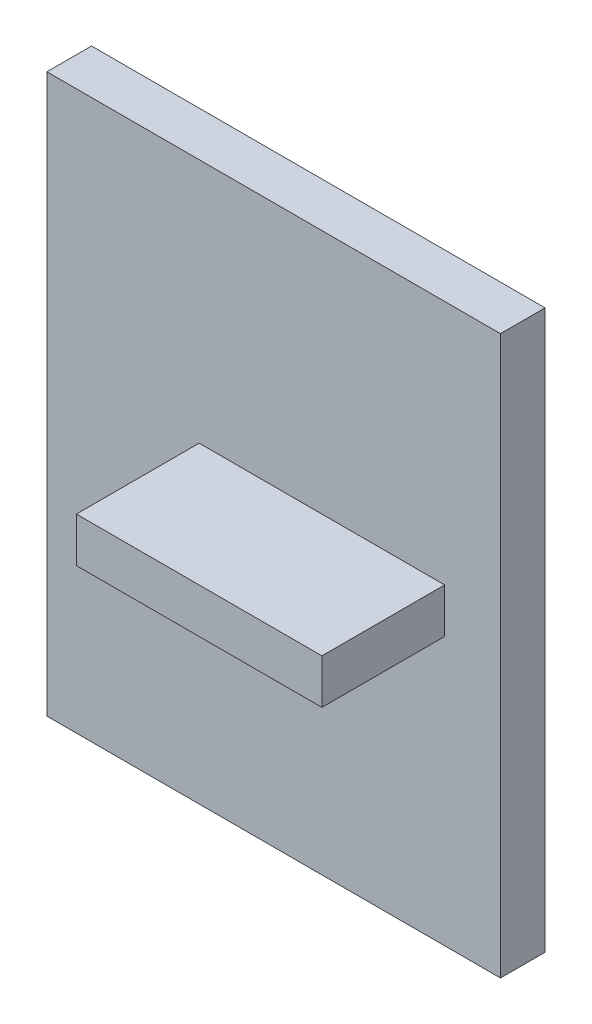
ISO-10303-21;
HEADER;
FILE_DESCRIPTION(('STEP AP214'),'2;1');
FILE_NAME('part.step','',(''),(''),'','','');
FILE_SCHEMA(('AUTOMOTIVE_DESIGN { 1 0 10303 214 1 1 1 1 }'));
ENDSEC;
DATA;
#1=APPLICATION_CONTEXT('core data for automotive mechanical design processes');
#2=APPLICATION_PROTOCOL_DEFINITION('international standard','automotive_design',2000,#1);
#3=PRODUCT_CONTEXT('',#1,'mechanical');
#4=PRODUCT('Part','Part','',(#3));
#5=PRODUCT_RELATED_PRODUCT_CATEGORY('part','',(#4));
#6=PRODUCT_DEFINITION_FORMATION('','',#4);
#7=PRODUCT_DEFINITION_CONTEXT('part definition',#1,'design');
#8=PRODUCT_DEFINITION('design','',#6,#7);
#9=PRODUCT_DEFINITION_SHAPE('','',#8);
#10=(LENGTH_UNIT() NAMED_UNIT(*) SI_UNIT(.MILLI.,.METRE.));
#11=(NAMED_UNIT(*) PLANE_ANGLE_UNIT() SI_UNIT($,.RADIAN.));
#12=(NAMED_UNIT(*) SI_UNIT($,.STERADIAN.) SOLID_ANGLE_UNIT());
#13=UNCERTAINTY_MEASURE_WITH_UNIT(LENGTH_MEASURE(1.E-05),#10,'distance_accuracy_value','');
#14=(GEOMETRIC_REPRESENTATION_CONTEXT(3) GLOBAL_UNCERTAINTY_ASSIGNED_CONTEXT((#13)) GLOBAL_UNIT_ASSIGNED_CONTEXT((#10,
#11,#12)) REPRESENTATION_CONTEXT('',''));
#15=CARTESIAN_POINT('',(0.,0.,0.));
#16=DIRECTION('',(0.,0.,1.));
#17=DIRECTION('',(1.,0.,0.));
#18=AXIS2_PLACEMENT_3D('',#15,#16,#17);
#19=CARTESIAN_POINT('',(-33.4000000000001,15.,75.));
#20=DIRECTION('',(-1.,0.,0.));
#21=DIRECTION('',(0.,0.,1.));
#22=AXIS2_PLACEMENT_3D('',#19,#20,#21);
#23=PLANE('',#22);
#24=DIRECTION('',(0.,1.,0.));
#25=VECTOR('',#24,1.);
#26=CARTESIAN_POINT('',(-33.4000000000001,15.,20.));
#27=LINE('',#26,#25);
#28=CARTESIAN_POINT('',(-33.4000000000001,-5.,20.));
#29=VERTEX_POINT('',#28);
#30=CARTESIAN_POINT('',(-33.4000000000001,15.,20.));
#31=VERTEX_POINT('',#30);
#32=EDGE_CURVE('E109',#29,#31,#27,.T.);
#33=ORIENTED_EDGE('',*,*,#32,.F.);
#34=DIRECTION('',(0.,0.,-1.));
#35=VECTOR('',#34,1.);
#36=CARTESIAN_POINT('',(-33.4000000000001,-5.,75.));
#37=LINE('',#36,#35);
#38=CARTESIAN_POINT('',(-33.4000000000001,-5.,75.));
#39=VERTEX_POINT('',#38);
#40=EDGE_CURVE('E12',#39,#29,#37,.T.);
#41=ORIENTED_EDGE('',*,*,#40,.F.);
#42=DIRECTION('',(0.,1.,0.));
#43=VECTOR('',#42,1.);
#44=CARTESIAN_POINT('',(-33.4000000000001,15.,75.));
#45=LINE('',#44,#43);
#46=CARTESIAN_POINT('',(-33.4000000000001,15.,75.));
#47=VERTEX_POINT('',#46);
#48=EDGE_CURVE('E103',#39,#47,#45,.T.);
#49=ORIENTED_EDGE('',*,*,#48,.T.);
#50=DIRECTION('',(0.,0.,-1.));
#51=VECTOR('',#50,1.);
#52=CARTESIAN_POINT('',(-33.4000000000001,15.,75.));
#53=LINE('',#52,#51);
#54=EDGE_CURVE('E48',#47,#31,#53,.T.);
#55=ORIENTED_EDGE('',*,*,#54,.T.);
#56=EDGE_LOOP('',(#33,#41,#49,#55));
#57=FACE_BOUND('',#56,.T.);
#58=ADVANCED_FACE('F45',(#57),#23,.T.);
#59=CARTESIAN_POINT('',(-33.4000000000001,-5.,75.));
#60=DIRECTION('',(0.,-1.,0.));
#61=DIRECTION('',(1.,0.,0.));
#62=AXIS2_PLACEMENT_3D('',#59,#60,#61);
#63=PLANE('',#62);
#64=DIRECTION('',(-1.,0.,0.));
#65=VECTOR('',#64,1.);
#66=CARTESIAN_POINT('',(-33.4000000000001,-5.,20.));
#67=LINE('',#66,#65);
#68=CARTESIAN_POINT('',(76.6,-5.00000000000001,20.));
#69=VERTEX_POINT('',#68);
#70=EDGE_CURVE('E105',#69,#29,#67,.T.);
#71=ORIENTED_EDGE('',*,*,#70,.F.);
#72=DIRECTION('',(0.,0.,-1.));
#73=VECTOR('',#72,1.);
#74=CARTESIAN_POINT('',(76.6,-5.00000000000001,75.));
#75=LINE('',#74,#73);
#76=CARTESIAN_POINT('',(76.6,-5.00000000000001,75.));
#77=VERTEX_POINT('',#76);
#78=EDGE_CURVE('E54',#77,#69,#75,.T.);
#79=ORIENTED_EDGE('',*,*,#78,.F.);
#80=DIRECTION('',(-1.,0.,0.));
#81=VECTOR('',#80,1.);
#82=CARTESIAN_POINT('',(-33.4000000000001,-5.,75.));
#83=LINE('',#82,#81);
#84=EDGE_CURVE('E100',#77,#39,#83,.T.);
#85=ORIENTED_EDGE('',*,*,#84,.T.);
#86=ORIENTED_EDGE('',*,*,#40,.T.);
#87=EDGE_LOOP('',(#71,#79,#85,#86));
#88=FACE_BOUND('',#87,.T.);
#89=ADVANCED_FACE('F119',(#88),#63,.T.);
#90=CARTESIAN_POINT('',(76.5999999999999,15.,75.));
#91=DIRECTION('',(1.,0.,0.));
#92=DIRECTION('',(0.,1.,0.));
#93=AXIS2_PLACEMENT_3D('',#90,#91,#92);
#94=PLANE('',#93);
#95=DIRECTION('',(0.,-1.,0.));
#96=VECTOR('',#95,1.);
#97=CARTESIAN_POINT('',(76.5999999999999,15.,20.));
#98=LINE('',#97,#96);
#99=CARTESIAN_POINT('',(76.5999999999999,15.,20.));
#100=VERTEX_POINT('',#99);
#101=EDGE_CURVE('E95',#100,#69,#98,.T.);
#102=ORIENTED_EDGE('',*,*,#101,.F.);
#103=DIRECTION('',(0.,0.,-1.));
#104=VECTOR('',#103,1.);
#105=CARTESIAN_POINT('',(76.5999999999999,15.,75.));
#106=LINE('',#105,#104);
#107=CARTESIAN_POINT('',(76.5999999999999,15.,75.));
#108=VERTEX_POINT('',#107);
#109=EDGE_CURVE('E90',#108,#100,#106,.T.);
#110=ORIENTED_EDGE('',*,*,#109,.F.);
#111=DIRECTION('',(0.,-1.,0.));
#112=VECTOR('',#111,1.);
#113=CARTESIAN_POINT('',(76.5999999999999,15.,75.));
#114=LINE('',#113,#112);
#115=EDGE_CURVE('E93',#108,#77,#114,.T.);
#116=ORIENTED_EDGE('',*,*,#115,.T.);
#117=ORIENTED_EDGE('',*,*,#78,.T.);
#118=EDGE_LOOP('',(#102,#110,#116,#117));
#119=FACE_BOUND('',#118,.T.);
#120=ADVANCED_FACE('F92',(#119),#94,.T.);
#121=CARTESIAN_POINT('',(-33.4000000000001,15.,75.));
#122=DIRECTION('',(0.,1.,0.));
#123=DIRECTION('',(-1.,0.,0.));
#124=AXIS2_PLACEMENT_3D('',#121,#122,#123);
#125=PLANE('',#124);
#126=DIRECTION('',(1.,0.,0.));
#127=VECTOR('',#126,1.);
#128=CARTESIAN_POINT('',(-33.4000000000001,15.,20.));
#129=LINE('',#128,#127);
#130=EDGE_CURVE('E112',#31,#100,#129,.T.);
#131=ORIENTED_EDGE('',*,*,#130,.F.);
#132=ORIENTED_EDGE('',*,*,#54,.F.);
#133=DIRECTION('',(1.,0.,0.));
#134=VECTOR('',#133,1.);
#135=CARTESIAN_POINT('',(-33.4000000000001,15.,75.));
#136=LINE('',#135,#134);
#137=EDGE_CURVE('E99',#47,#108,#136,.T.);
#138=ORIENTED_EDGE('',*,*,#137,.T.);
#139=ORIENTED_EDGE('',*,*,#109,.T.);
#140=EDGE_LOOP('',(#131,#132,#138,#139));
#141=FACE_BOUND('',#140,.T.);
#142=ADVANCED_FACE('F102',(#141),#125,.T.);
#143=CARTESIAN_POINT('',(0.,0.,75.));
#144=DIRECTION('',(0.,0.,1.));
#145=DIRECTION('',(1.,0.,0.));
#146=AXIS2_PLACEMENT_3D('',#143,#144,#145);
#147=PLANE('',#146);
#148=ORIENTED_EDGE('',*,*,#48,.F.);
#149=ORIENTED_EDGE('',*,*,#84,.F.);
#150=ORIENTED_EDGE('',*,*,#115,.F.);
#151=ORIENTED_EDGE('',*,*,#137,.F.);
#152=EDGE_LOOP('',(#148,#149,#150,#151));
#153=FACE_BOUND('',#152,.T.);
#154=ADVANCED_FACE('F98',(#153),#147,.T.);
#155=CARTESIAN_POINT('',(0.,0.,20.));
#156=DIRECTION('',(0.,0.,1.));
#157=DIRECTION('',(1.,0.,0.));
#158=AXIS2_PLACEMENT_3D('',#155,#156,#157);
#159=PLANE('',#158);
#160=ORIENTED_EDGE('',*,*,#32,.T.);
#161=ORIENTED_EDGE('',*,*,#130,.T.);
#162=ORIENTED_EDGE('',*,*,#101,.T.);
#163=ORIENTED_EDGE('',*,*,#70,.T.);
#164=EDGE_LOOP('',(#160,#161,#162,#163));
#165=FACE_BOUND('',#164,.T.);
#166=ADVANCED_FACE('F118',(#165),#159,.F.);
#167=CLOSED_SHELL('',(#58,#89,#120,#142,#154,#166));
#168=MANIFOLD_SOLID_BREP('B2',#167);
#169=CARTESIAN_POINT('',(101.6,-125.,20.));
#170=DIRECTION('',(-1.,0.,0.));
#171=DIRECTION('',(0.,0.,1.));
#172=AXIS2_PLACEMENT_3D('',#169,#170,#171);
#173=PLANE('',#172);
#174=DIRECTION('',(0.,1.,0.));
#175=VECTOR('',#174,1.);
#176=CARTESIAN_POINT('',(101.6,-125.,0.));
#177=LINE('',#176,#175);
#178=CARTESIAN_POINT('',(101.6,-125.,0.));
#179=VERTEX_POINT('',#178);
#180=CARTESIAN_POINT('',(101.6,125.,0.));
#181=VERTEX_POINT('',#180);
#182=EDGE_CURVE('E232',#179,#181,#177,.T.);
#183=ORIENTED_EDGE('',*,*,#182,.T.);
#184=DIRECTION('',(0.,0.,-1.));
#185=VECTOR('',#184,1.);
#186=CARTESIAN_POINT('',(101.6,125.,20.));
#187=LINE('',#186,#185);
#188=CARTESIAN_POINT('',(101.6,125.,20.));
#189=VERTEX_POINT('',#188);
#190=EDGE_CURVE('E43',#189,#181,#187,.T.);
#191=ORIENTED_EDGE('',*,*,#190,.F.);
#192=DIRECTION('',(0.,1.,0.));
#193=VECTOR('',#192,1.);
#194=CARTESIAN_POINT('',(101.6,-125.,20.));
#195=LINE('',#194,#193);
#196=CARTESIAN_POINT('',(101.6,-125.,20.));
#197=VERTEX_POINT('',#196);
#198=EDGE_CURVE('E220',#197,#189,#195,.T.);
#199=ORIENTED_EDGE('',*,*,#198,.F.);
#200=DIRECTION('',(0.,0.,-1.));
#201=VECTOR('',#200,1.);
#202=CARTESIAN_POINT('',(101.6,-125.,20.));
#203=LINE('',#202,#201);
#204=EDGE_CURVE('E228',#197,#179,#203,.T.);
#205=ORIENTED_EDGE('',*,*,#204,.T.);
#206=EDGE_LOOP('',(#183,#191,#199,#205));
#207=FACE_BOUND('',#206,.T.);
#208=ADVANCED_FACE('F169',(#207),#173,.F.);
#209=CARTESIAN_POINT('',(-101.6,125.,20.));
#210=DIRECTION('',(0.,-1.,0.));
#211=DIRECTION('',(0.,0.,-1.));
#212=AXIS2_PLACEMENT_3D('',#209,#210,#211);
#213=PLANE('',#212);
#214=DIRECTION('',(-1.,0.,0.));
#215=VECTOR('',#214,1.);
#216=CARTESIAN_POINT('',(-101.6,125.,0.));
#217=LINE('',#216,#215);
#218=CARTESIAN_POINT('',(-101.6,125.,0.));
#219=VERTEX_POINT('',#218);
#220=EDGE_CURVE('E224',#181,#219,#217,.T.);
#221=ORIENTED_EDGE('',*,*,#220,.T.);
#222=DIRECTION('',(0.,0.,-1.));
#223=VECTOR('',#222,1.);
#224=CARTESIAN_POINT('',(-101.6,125.,20.));
#225=LINE('',#224,#223);
#226=CARTESIAN_POINT('',(-101.6,125.,20.));
#227=VERTEX_POINT('',#226);
#228=EDGE_CURVE('E177',#227,#219,#225,.T.);
#229=ORIENTED_EDGE('',*,*,#228,.F.);
#230=DIRECTION('',(-1.,0.,0.));
#231=VECTOR('',#230,1.);
#232=CARTESIAN_POINT('',(-101.6,125.,20.));
#233=LINE('',#232,#231);
#234=EDGE_CURVE('E215',#189,#227,#233,.T.);
#235=ORIENTED_EDGE('',*,*,#234,.F.);
#236=ORIENTED_EDGE('',*,*,#190,.T.);
#237=EDGE_LOOP('',(#221,#229,#235,#236));
#238=FACE_BOUND('',#237,.T.);
#239=ADVANCED_FACE('F223',(#238),#213,.F.);
#240=CARTESIAN_POINT('',(-101.6,-125.,20.));
#241=DIRECTION('',(1.,0.,0.));
#242=DIRECTION('',(0.,0.,-1.));
#243=AXIS2_PLACEMENT_3D('',#240,#241,#242);
#244=PLANE('',#243);
#245=DIRECTION('',(0.,-1.,0.));
#246=VECTOR('',#245,1.);
#247=CARTESIAN_POINT('',(-101.6,-125.,0.));
#248=LINE('',#247,#246);
#249=CARTESIAN_POINT('',(-101.6,-125.,0.));
#250=VERTEX_POINT('',#249);
#251=EDGE_CURVE('E202',#219,#250,#248,.T.);
#252=ORIENTED_EDGE('',*,*,#251,.T.);
#253=DIRECTION('',(0.,0.,-1.));
#254=VECTOR('',#253,1.);
#255=CARTESIAN_POINT('',(-101.6,-125.,20.));
#256=LINE('',#255,#254);
#257=CARTESIAN_POINT('',(-101.6,-125.,20.));
#258=VERTEX_POINT('',#257);
#259=EDGE_CURVE('E225',#258,#250,#256,.T.);
#260=ORIENTED_EDGE('',*,*,#259,.F.);
#261=DIRECTION('',(0.,-1.,0.));
#262=VECTOR('',#261,1.);
#263=CARTESIAN_POINT('',(-101.6,-125.,20.));
#264=LINE('',#263,#262);
#265=EDGE_CURVE('E218',#227,#258,#264,.T.);
#266=ORIENTED_EDGE('',*,*,#265,.F.);
#267=ORIENTED_EDGE('',*,*,#228,.T.);
#268=EDGE_LOOP('',(#252,#260,#266,#267));
#269=FACE_BOUND('',#268,.T.);
#270=ADVANCED_FACE('F226',(#269),#244,.F.);
#271=CARTESIAN_POINT('',(-101.6,-125.,20.));
#272=DIRECTION('',(0.,1.,0.));
#273=DIRECTION('',(0.,0.,1.));
#274=AXIS2_PLACEMENT_3D('',#271,#272,#273);
#275=PLANE('',#274);
#276=DIRECTION('',(1.,0.,0.));
#277=VECTOR('',#276,1.);
#278=CARTESIAN_POINT('',(-101.6,-125.,0.));
#279=LINE('',#278,#277);
#280=EDGE_CURVE('E208',#250,#179,#279,.T.);
#281=ORIENTED_EDGE('',*,*,#280,.T.);
#282=ORIENTED_EDGE('',*,*,#204,.F.);
#283=DIRECTION('',(1.,0.,0.));
#284=VECTOR('',#283,1.);
#285=CARTESIAN_POINT('',(-101.6,-125.,20.));
#286=LINE('',#285,#284);
#287=EDGE_CURVE('E185',#258,#197,#286,.T.);
#288=ORIENTED_EDGE('',*,*,#287,.F.);
#289=ORIENTED_EDGE('',*,*,#259,.T.);
#290=EDGE_LOOP('',(#281,#282,#288,#289));
#291=FACE_BOUND('',#290,.T.);
#292=ADVANCED_FACE('F239',(#291),#275,.F.);
#293=CARTESIAN_POINT('',(0.,0.,20.));
#294=DIRECTION('',(0.,0.,-1.));
#295=DIRECTION('',(-1.,0.,0.));
#296=AXIS2_PLACEMENT_3D('',#293,#294,#295);
#297=PLANE('',#296);
#298=ORIENTED_EDGE('',*,*,#198,.T.);
#299=ORIENTED_EDGE('',*,*,#234,.T.);
#300=ORIENTED_EDGE('',*,*,#265,.T.);
#301=ORIENTED_EDGE('',*,*,#287,.T.);
#302=EDGE_LOOP('',(#298,#299,#300,#301));
#303=FACE_BOUND('',#302,.T.);
#304=ADVANCED_FACE('F216',(#303),#297,.F.);
#305=CARTESIAN_POINT('',(0.,0.,0.));
#306=DIRECTION('',(0.,0.,-1.));
#307=DIRECTION('',(-1.,0.,0.));
#308=AXIS2_PLACEMENT_3D('',#305,#306,#307);
#309=PLANE('',#308);
#310=ORIENTED_EDGE('',*,*,#182,.F.);
#311=ORIENTED_EDGE('',*,*,#280,.F.);
#312=ORIENTED_EDGE('',*,*,#251,.F.);
#313=ORIENTED_EDGE('',*,*,#220,.F.);
#314=EDGE_LOOP('',(#310,#311,#312,#313));
#315=FACE_BOUND('',#314,.T.);
#316=ADVANCED_FACE('F242',(#315),#309,.T.);
#317=CLOSED_SHELL('',(#208,#239,#270,#292,#304,#316));
#318=MANIFOLD_SOLID_BREP('B6',#317);
#319=ADVANCED_BREP_SHAPE_REPRESENTATION('',(#18,#168,#318),#14);
#320=SHAPE_DEFINITION_REPRESENTATION(#9,#319);
ENDSEC;
END-ISO-10303-21;
